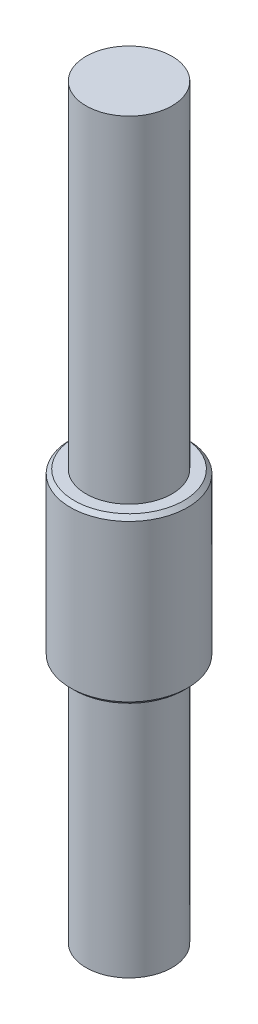
ISO-10303-21;
HEADER;
FILE_DESCRIPTION(('STEP AP214'),'2;1');
FILE_NAME('part.step','',(''),(''),'','','');
FILE_SCHEMA(('AUTOMOTIVE_DESIGN { 1 0 10303 214 1 1 1 1 }'));
ENDSEC;
DATA;
#1=APPLICATION_CONTEXT('core data for automotive mechanical design processes');
#2=APPLICATION_PROTOCOL_DEFINITION('international standard','automotive_design',2000,#1);
#3=PRODUCT_CONTEXT('',#1,'mechanical');
#4=PRODUCT('Part','Part','',(#3));
#5=PRODUCT_RELATED_PRODUCT_CATEGORY('part','',(#4));
#6=PRODUCT_DEFINITION_FORMATION('','',#4);
#7=PRODUCT_DEFINITION_CONTEXT('part definition',#1,'design');
#8=PRODUCT_DEFINITION('design','',#6,#7);
#9=PRODUCT_DEFINITION_SHAPE('','',#8);
#10=(LENGTH_UNIT() NAMED_UNIT(*) SI_UNIT(.MILLI.,.METRE.));
#11=(NAMED_UNIT(*) PLANE_ANGLE_UNIT() SI_UNIT($,.RADIAN.));
#12=(NAMED_UNIT(*) SI_UNIT($,.STERADIAN.) SOLID_ANGLE_UNIT());
#13=UNCERTAINTY_MEASURE_WITH_UNIT(LENGTH_MEASURE(1.E-05),#10,'distance_accuracy_value','');
#14=(GEOMETRIC_REPRESENTATION_CONTEXT(3) GLOBAL_UNCERTAINTY_ASSIGNED_CONTEXT((#13)) GLOBAL_UNIT_ASSIGNED_CONTEXT((#10,
#11,#12)) REPRESENTATION_CONTEXT('',''));
#15=CARTESIAN_POINT('',(0.,0.,0.));
#16=DIRECTION('',(0.,0.,1.));
#17=DIRECTION('',(1.,0.,0.));
#18=AXIS2_PLACEMENT_3D('',#15,#16,#17);
#19=CARTESIAN_POINT('',(0.,0.,0.));
#20=DIRECTION('',(0.,-1.,0.));
#21=DIRECTION('',(0.,0.,-1.));
#22=AXIS2_PLACEMENT_3D('',#19,#20,#21);
#23=PLANE('',#22);
#24=CARTESIAN_POINT('',(0.,0.,0.));
#25=DIRECTION('',(0.,-1.,0.));
#26=DIRECTION('',(0.,0.,-1.));
#27=AXIS2_PLACEMENT_3D('',#24,#25,#26);
#28=CIRCLE('',#27,2.5);
#29=CARTESIAN_POINT('',(0.,0.,-2.5));
#30=VERTEX_POINT('',#29);
#31=EDGE_CURVE('E54',#30,#30,#28,.T.);
#32=ORIENTED_EDGE('',*,*,#31,.F.);
#33=EDGE_LOOP('',(#32));
#34=FACE_BOUND('',#33,.T.);
#35=CARTESIAN_POINT('',(0.,0.,0.));
#36=DIRECTION('',(0.,-1.,0.));
#37=DIRECTION('',(0.,0.,-1.));
#38=AXIS2_PLACEMENT_3D('',#35,#36,#37);
#39=CIRCLE('',#38,5.5);
#40=CARTESIAN_POINT('',(0.,0.,-5.5));
#41=VERTEX_POINT('',#40);
#42=EDGE_CURVE('E11',#41,#41,#39,.T.);
#43=ORIENTED_EDGE('',*,*,#42,.T.);
#44=EDGE_LOOP('',(#43));
#45=FACE_BOUND('',#44,.T.);
#46=ADVANCED_FACE('F34',(#34,#45),#23,.T.);
#47=CARTESIAN_POINT('',(0.,6.48025335050982E-12,0.));
#48=DIRECTION('',(0.,-1.,0.));
#49=DIRECTION('',(0.,0.,-1.));
#50=AXIS2_PLACEMENT_3D('',#47,#48,#49);
#51=CYLINDRICAL_SURFACE('',#50,5.5);
#52=CARTESIAN_POINT('',(0.,31.5,0.));
#53=DIRECTION('',(0.,-1.,0.));
#54=DIRECTION('',(0.,0.,-1.));
#55=AXIS2_PLACEMENT_3D('',#52,#53,#54);
#56=CIRCLE('',#55,5.5);
#57=CARTESIAN_POINT('',(0.,31.5,-5.5));
#58=VERTEX_POINT('',#57);
#59=EDGE_CURVE('E40',#58,#58,#56,.T.);
#60=ORIENTED_EDGE('',*,*,#59,.T.);
#61=EDGE_LOOP('',(#60));
#62=FACE_BOUND('',#61,.T.);
#63=ORIENTED_EDGE('',*,*,#42,.F.);
#64=EDGE_LOOP('',(#63));
#65=FACE_BOUND('',#64,.T.);
#66=ADVANCED_FACE('F78',(#62,#65),#51,.T.);
#67=CARTESIAN_POINT('',(5.5,31.5,0.));
#68=DIRECTION('',(0.,-1.,0.));
#69=DIRECTION('',(0.,0.,-1.));
#70=AXIS2_PLACEMENT_3D('',#67,#68,#69);
#71=PLANE('',#70);
#72=CARTESIAN_POINT('',(0.,31.5,0.));
#73=DIRECTION('',(0.,-1.,0.));
#74=DIRECTION('',(0.,0.,-1.));
#75=AXIS2_PLACEMENT_3D('',#72,#73,#74);
#76=CIRCLE('',#75,7.);
#77=CARTESIAN_POINT('',(0.,31.5,-7.));
#78=VERTEX_POINT('',#77);
#79=EDGE_CURVE('E73',#78,#78,#76,.T.);
#80=ORIENTED_EDGE('',*,*,#79,.T.);
#81=EDGE_LOOP('',(#80));
#82=FACE_BOUND('',#81,.T.);
#83=ORIENTED_EDGE('',*,*,#59,.F.);
#84=EDGE_LOOP('',(#83));
#85=FACE_BOUND('',#84,.T.);
#86=ADVANCED_FACE('F81',(#82,#85),#71,.T.);
#87=CARTESIAN_POINT('',(0.,31.5,0.));
#88=DIRECTION('',(0.,1.,0.));
#89=DIRECTION('',(0.,0.,1.));
#90=AXIS2_PLACEMENT_3D('',#87,#88,#89);
#91=CONICAL_SURFACE('',#90,7.,0.785398163397448);
#92=CARTESIAN_POINT('',(0.,32.,0.));
#93=DIRECTION('',(0.,-1.,0.));
#94=DIRECTION('',(0.,0.,-1.));
#95=AXIS2_PLACEMENT_3D('',#92,#93,#94);
#96=CIRCLE('',#95,7.5);
#97=CARTESIAN_POINT('',(0.,32.,-7.5));
#98=VERTEX_POINT('',#97);
#99=EDGE_CURVE('E70',#98,#98,#96,.T.);
#100=ORIENTED_EDGE('',*,*,#99,.T.);
#101=EDGE_LOOP('',(#100));
#102=FACE_BOUND('',#101,.T.);
#103=ORIENTED_EDGE('',*,*,#79,.F.);
#104=EDGE_LOOP('',(#103));
#105=FACE_BOUND('',#104,.T.);
#106=ADVANCED_FACE('F83',(#102,#105),#91,.T.);
#107=CARTESIAN_POINT('',(0.,6.48025335050982E-12,0.));
#108=DIRECTION('',(0.,-1.,0.));
#109=DIRECTION('',(0.,0.,-1.));
#110=AXIS2_PLACEMENT_3D('',#107,#108,#109);
#111=CYLINDRICAL_SURFACE('',#110,7.5);
#112=CARTESIAN_POINT('',(0.,52.,0.));
#113=DIRECTION('',(0.,-1.,0.));
#114=DIRECTION('',(0.,0.,-1.));
#115=AXIS2_PLACEMENT_3D('',#112,#113,#114);
#116=CIRCLE('',#115,7.5);
#117=CARTESIAN_POINT('',(0.,52.,-7.5));
#118=VERTEX_POINT('',#117);
#119=EDGE_CURVE('E67',#118,#118,#116,.T.);
#120=ORIENTED_EDGE('',*,*,#119,.T.);
#121=EDGE_LOOP('',(#120));
#122=FACE_BOUND('',#121,.T.);
#123=ORIENTED_EDGE('',*,*,#99,.F.);
#124=EDGE_LOOP('',(#123));
#125=FACE_BOUND('',#124,.T.);
#126=ADVANCED_FACE('F90',(#122,#125),#111,.T.);
#127=CARTESIAN_POINT('',(0.,52.,0.));
#128=DIRECTION('',(0.,-1.,0.));
#129=DIRECTION('',(0.,0.,-1.));
#130=AXIS2_PLACEMENT_3D('',#127,#128,#129);
#131=CONICAL_SURFACE('',#130,7.5,0.785398163397448);
#132=CARTESIAN_POINT('',(0.,52.5,0.));
#133=DIRECTION('',(0.,-1.,0.));
#134=DIRECTION('',(0.,0.,-1.));
#135=AXIS2_PLACEMENT_3D('',#132,#133,#134);
#136=CIRCLE('',#135,7.);
#137=CARTESIAN_POINT('',(0.,52.5,-7.));
#138=VERTEX_POINT('',#137);
#139=EDGE_CURVE('E64',#138,#138,#136,.T.);
#140=ORIENTED_EDGE('',*,*,#139,.T.);
#141=EDGE_LOOP('',(#140));
#142=FACE_BOUND('',#141,.T.);
#143=ORIENTED_EDGE('',*,*,#119,.F.);
#144=EDGE_LOOP('',(#143));
#145=FACE_BOUND('',#144,.T.);
#146=ADVANCED_FACE('F116',(#142,#145),#131,.T.);
#147=CARTESIAN_POINT('',(7.,52.5,0.));
#148=DIRECTION('',(0.,1.,0.));
#149=DIRECTION('',(0.,0.,1.));
#150=AXIS2_PLACEMENT_3D('',#147,#148,#149);
#151=PLANE('',#150);
#152=CARTESIAN_POINT('',(0.,52.5,0.));
#153=DIRECTION('',(0.,-1.,0.));
#154=DIRECTION('',(0.,0.,-1.));
#155=AXIS2_PLACEMENT_3D('',#152,#153,#154);
#156=CIRCLE('',#155,5.5);
#157=CARTESIAN_POINT('',(0.,52.5,-5.5));
#158=VERTEX_POINT('',#157);
#159=EDGE_CURVE('E57',#158,#158,#156,.T.);
#160=ORIENTED_EDGE('',*,*,#159,.T.);
#161=EDGE_LOOP('',(#160));
#162=FACE_BOUND('',#161,.T.);
#163=ORIENTED_EDGE('',*,*,#139,.F.);
#164=EDGE_LOOP('',(#163));
#165=FACE_BOUND('',#164,.T.);
#166=ADVANCED_FACE('F112',(#162,#165),#151,.T.);
#167=CARTESIAN_POINT('',(0.,6.48025335050982E-12,0.));
#168=DIRECTION('',(0.,-1.,0.));
#169=DIRECTION('',(0.,0.,-1.));
#170=AXIS2_PLACEMENT_3D('',#167,#168,#169);
#171=CYLINDRICAL_SURFACE('',#170,5.5);
#172=CARTESIAN_POINT('',(0.,95.5,0.));
#173=DIRECTION('',(0.,-1.,0.));
#174=DIRECTION('',(0.,0.,-1.));
#175=AXIS2_PLACEMENT_3D('',#172,#173,#174);
#176=CIRCLE('',#175,5.5);
#177=CARTESIAN_POINT('',(0.,95.5,-5.5));
#178=VERTEX_POINT('',#177);
#179=EDGE_CURVE('E53',#178,#178,#176,.T.);
#180=ORIENTED_EDGE('',*,*,#179,.T.);
#181=EDGE_LOOP('',(#180));
#182=FACE_BOUND('',#181,.T.);
#183=ORIENTED_EDGE('',*,*,#159,.F.);
#184=EDGE_LOOP('',(#183));
#185=FACE_BOUND('',#184,.T.);
#186=ADVANCED_FACE('F108',(#182,#185),#171,.T.);
#187=CARTESIAN_POINT('',(5.5,95.5,0.));
#188=DIRECTION('',(0.,1.,0.));
#189=DIRECTION('',(0.,0.,1.));
#190=AXIS2_PLACEMENT_3D('',#187,#188,#189);
#191=PLANE('',#190);
#192=ORIENTED_EDGE('',*,*,#179,.F.);
#193=EDGE_LOOP('',(#192));
#194=FACE_BOUND('',#193,.T.);
#195=ADVANCED_FACE('F47',(#194),#191,.T.);
#196=CARTESIAN_POINT('',(0.,7.,0.));
#197=DIRECTION('',(0.,-1.,0.));
#198=DIRECTION('',(0.,0.,-1.));
#199=AXIS2_PLACEMENT_3D('',#196,#197,#198);
#200=CONICAL_SURFACE('',#199,2.5,1.02974425867665);
#201=CARTESIAN_POINT('',(0.,8.5021515475689,0.));
#202=VERTEX_POINT('',#201);
#203=VERTEX_LOOP('',#202);
#204=FACE_BOUND('',#203,.T.);
#205=CARTESIAN_POINT('',(0.,7.,0.));
#206=DIRECTION('',(0.,-1.,0.));
#207=DIRECTION('',(0.,0.,-1.));
#208=AXIS2_PLACEMENT_3D('',#205,#206,#207);
#209=CIRCLE('',#208,2.5);
#210=CARTESIAN_POINT('',(0.,7.,-2.5));
#211=VERTEX_POINT('',#210);
#212=EDGE_CURVE('E51',#211,#211,#209,.T.);
#213=ORIENTED_EDGE('',*,*,#212,.T.);
#214=EDGE_LOOP('',(#213));
#215=FACE_BOUND('',#214,.T.);
#216=ADVANCED_FACE('F43',(#204,#215),#200,.F.);
#217=CARTESIAN_POINT('',(0.,0.,0.));
#218=DIRECTION('',(0.,-1.,0.));
#219=DIRECTION('',(0.,0.,-1.));
#220=AXIS2_PLACEMENT_3D('',#217,#218,#219);
#221=CYLINDRICAL_SURFACE('',#220,2.5);
#222=ORIENTED_EDGE('',*,*,#212,.F.);
#223=EDGE_LOOP('',(#222));
#224=FACE_BOUND('',#223,.T.);
#225=ORIENTED_EDGE('',*,*,#31,.T.);
#226=EDGE_LOOP('',(#225));
#227=FACE_BOUND('',#226,.T.);
#228=ADVANCED_FACE('F46',(#224,#227),#221,.F.);
#229=CLOSED_SHELL('',(#46,#66,#86,#106,#126,#146,#166,#186,#195,#216,#228));
#230=MANIFOLD_SOLID_BREP('B2',#229);
#231=ADVANCED_BREP_SHAPE_REPRESENTATION('',(#18,#230),#14);
#232=SHAPE_DEFINITION_REPRESENTATION(#9,#231);
ENDSEC;
END-ISO-10303-21;
